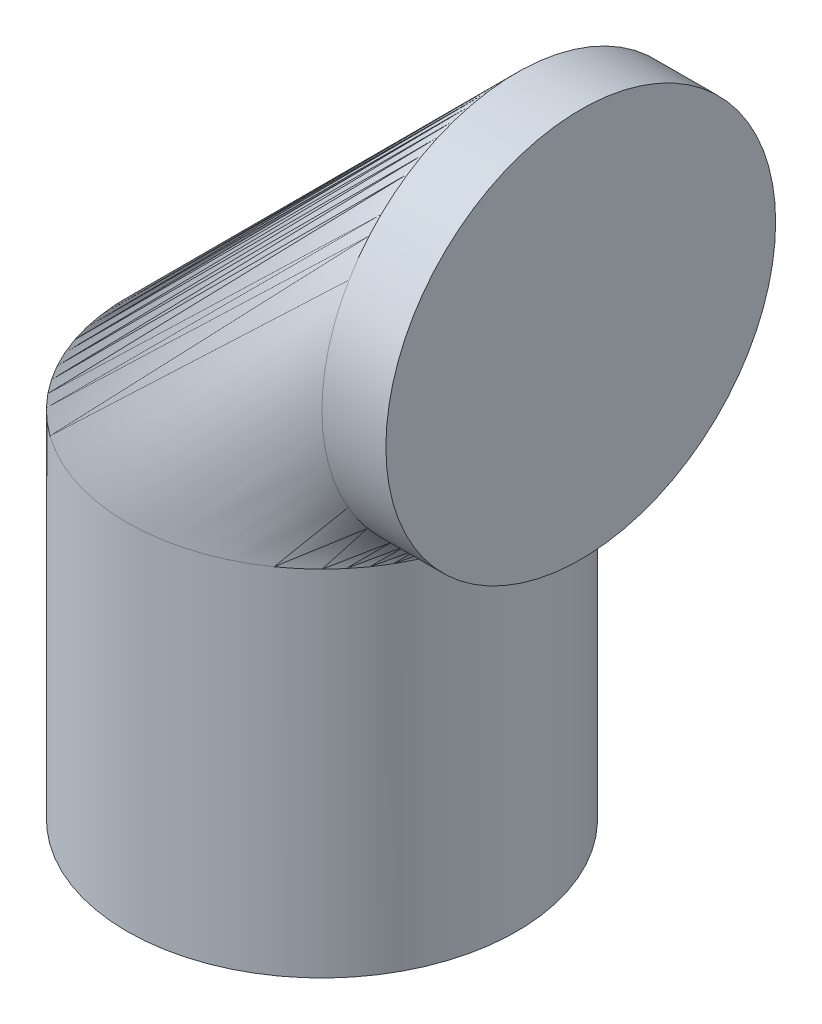
ISO-10303-21;
HEADER;
FILE_DESCRIPTION(('STEP AP214'),'2;1');
FILE_NAME('part.step','',(''),(''),'','','');
FILE_SCHEMA(('AUTOMOTIVE_DESIGN { 1 0 10303 214 1 1 1 1 }'));
ENDSEC;
DATA;
#1=APPLICATION_CONTEXT('core data for automotive mechanical design processes');
#2=APPLICATION_PROTOCOL_DEFINITION('international standard','automotive_design',2000,#1);
#3=PRODUCT_CONTEXT('',#1,'mechanical');
#4=PRODUCT('Part','Part','',(#3));
#5=PRODUCT_RELATED_PRODUCT_CATEGORY('part','',(#4));
#6=PRODUCT_DEFINITION_FORMATION('','',#4);
#7=PRODUCT_DEFINITION_CONTEXT('part definition',#1,'design');
#8=PRODUCT_DEFINITION('design','',#6,#7);
#9=PRODUCT_DEFINITION_SHAPE('','',#8);
#10=(LENGTH_UNIT() NAMED_UNIT(*) SI_UNIT(.MILLI.,.METRE.));
#11=(NAMED_UNIT(*) PLANE_ANGLE_UNIT() SI_UNIT($,.RADIAN.));
#12=(NAMED_UNIT(*) SI_UNIT($,.STERADIAN.) SOLID_ANGLE_UNIT());
#13=UNCERTAINTY_MEASURE_WITH_UNIT(LENGTH_MEASURE(1.E-05),#10,'distance_accuracy_value','');
#14=(GEOMETRIC_REPRESENTATION_CONTEXT(3) GLOBAL_UNCERTAINTY_ASSIGNED_CONTEXT((#13)) GLOBAL_UNIT_ASSIGNED_CONTEXT((#10,
#11,#12)) REPRESENTATION_CONTEXT('',''));
#15=CARTESIAN_POINT('',(0.,0.,0.));
#16=DIRECTION('',(0.,0.,1.));
#17=DIRECTION('',(1.,0.,0.));
#18=AXIS2_PLACEMENT_3D('',#15,#16,#17);
#19=CARTESIAN_POINT('',(0.,0.,0.));
#20=DIRECTION('',(0.,1.,0.));
#21=DIRECTION('',(0.,0.,1.));
#22=AXIS2_PLACEMENT_3D('',#19,#20,#21);
#23=PLANE('',#22);
#24=CARTESIAN_POINT('',(0.,0.,0.));
#25=DIRECTION('',(0.,1.,0.));
#26=DIRECTION('',(0.,0.,1.));
#27=AXIS2_PLACEMENT_3D('',#24,#25,#26);
#28=CIRCLE('',#27,25.);
#29=CARTESIAN_POINT('',(0.,0.,25.));
#30=VERTEX_POINT('',#29);
#31=EDGE_CURVE('E54',#30,#30,#28,.T.);
#32=ORIENTED_EDGE('',*,*,#31,.F.);
#33=EDGE_LOOP('',(#32));
#34=FACE_BOUND('',#33,.T.);
#35=ADVANCED_FACE('F38',(#34),#23,.F.);
#36=CARTESIAN_POINT('',(33.2,70.42,0.));
#37=DIRECTION('',(1.,0.,0.));
#38=DIRECTION('',(0.,0.,1.));
#39=AXIS2_PLACEMENT_3D('',#36,#37,#38);
#40=PLANE('',#39);
#41=CARTESIAN_POINT('',(33.2,70.42,0.));
#42=DIRECTION('',(1.,0.,0.));
#43=DIRECTION('',(0.,0.,1.));
#44=AXIS2_PLACEMENT_3D('',#41,#42,#43);
#45=CIRCLE('',#44,25.);
#46=CARTESIAN_POINT('',(33.2,70.42,25.));
#47=VERTEX_POINT('',#46);
#48=EDGE_CURVE('E11',#47,#47,#45,.T.);
#49=ORIENTED_EDGE('',*,*,#48,.T.);
#50=EDGE_LOOP('',(#49));
#51=FACE_BOUND('',#50,.T.);
#52=ADVANCED_FACE('F61',(#51),#40,.T.);
#53=CARTESIAN_POINT('',(0.,0.,0.));
#54=DIRECTION('',(0.,1.,0.));
#55=DIRECTION('',(-1.,0.,0.));
#56=AXIS2_PLACEMENT_3D('',#53,#54,#55);
#57=CYLINDRICAL_SURFACE('',#56,25.);
#58=CARTESIAN_POINT('',(0.,45.42,0.));
#59=DIRECTION('',(0.,1.,0.));
#60=DIRECTION('',(0.,0.,1.));
#61=AXIS2_PLACEMENT_3D('',#58,#59,#60);
#62=CIRCLE('',#61,25.);
#63=CARTESIAN_POINT('',(25.,45.42,0.));
#64=VERTEX_POINT('',#63);
#65=EDGE_CURVE('E48',#64,#64,#62,.T.);
#66=ORIENTED_EDGE('',*,*,#65,.F.);
#67=EDGE_LOOP('',(#66));
#68=FACE_BOUND('',#67,.T.);
#69=ORIENTED_EDGE('',*,*,#31,.T.);
#70=EDGE_LOOP('',(#69));
#71=FACE_BOUND('',#70,.T.);
#72=ADVANCED_FACE('F49',(#68,#71),#57,.T.);
#73=CARTESIAN_POINT('',(25.,45.42,0.));
#74=DIRECTION('',(0.,0.,-1.));
#75=DIRECTION('',(-1.,0.,0.));
#76=AXIS2_PLACEMENT_3D('',#73,#74,#75);
#77=TOROIDAL_SURFACE('',#76,25.,25.);
#78=CARTESIAN_POINT('',(25.,70.42,0.));
#79=DIRECTION('',(1.,0.,0.));
#80=DIRECTION('',(0.,0.,1.));
#81=AXIS2_PLACEMENT_3D('',#78,#79,#80);
#82=CIRCLE('',#81,25.);
#83=EDGE_CURVE('E44',#64,#64,#82,.T.);
#84=ORIENTED_EDGE('',*,*,#83,.F.);
#85=ORIENTED_EDGE('',*,*,#65,.T.);
#86=EDGE_LOOP('',(#84,#85));
#87=FACE_BOUND('',#86,.T.);
#88=ADVANCED_FACE('F68',(#87),#77,.T.);
#89=CARTESIAN_POINT('',(25.,70.42,0.));
#90=DIRECTION('',(1.,0.,0.));
#91=DIRECTION('',(0.,1.,0.));
#92=AXIS2_PLACEMENT_3D('',#89,#90,#91);
#93=CYLINDRICAL_SURFACE('',#92,25.);
#94=ORIENTED_EDGE('',*,*,#48,.F.);
#95=EDGE_LOOP('',(#94));
#96=FACE_BOUND('',#95,.T.);
#97=ORIENTED_EDGE('',*,*,#83,.T.);
#98=EDGE_LOOP('',(#97));
#99=FACE_BOUND('',#98,.T.);
#100=ADVANCED_FACE('F66',(#96,#99),#93,.T.);
#101=CLOSED_SHELL('',(#35,#52,#72,#88,#100));
#102=MANIFOLD_SOLID_BREP('B2',#101);
#103=ADVANCED_BREP_SHAPE_REPRESENTATION('',(#18,#102),#14);
#104=SHAPE_DEFINITION_REPRESENTATION(#9,#103);
ENDSEC;
END-ISO-10303-21;
